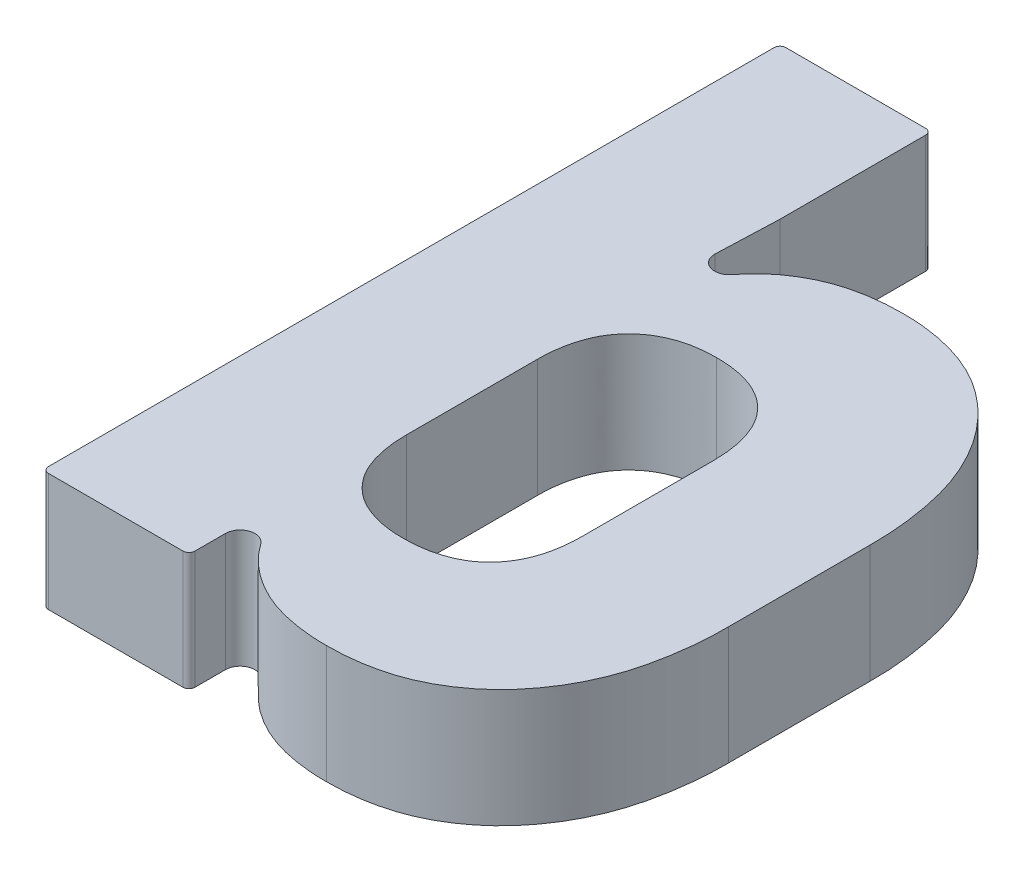
ISO-10303-21;
HEADER;
FILE_DESCRIPTION(('STEP AP214'),'2;1');
FILE_NAME('part.step','',(''),(''),'','','');
FILE_SCHEMA(('AUTOMOTIVE_DESIGN { 1 0 10303 214 1 1 1 1 }'));
ENDSEC;
DATA;
#1=APPLICATION_CONTEXT('core data for automotive mechanical design processes');
#2=APPLICATION_PROTOCOL_DEFINITION('international standard','automotive_design',2000,#1);
#3=PRODUCT_CONTEXT('',#1,'mechanical');
#4=PRODUCT('Part','Part','',(#3));
#5=PRODUCT_RELATED_PRODUCT_CATEGORY('part','',(#4));
#6=PRODUCT_DEFINITION_FORMATION('','',#4);
#7=PRODUCT_DEFINITION_CONTEXT('part definition',#1,'design');
#8=PRODUCT_DEFINITION('design','',#6,#7);
#9=PRODUCT_DEFINITION_SHAPE('','',#8);
#10=(LENGTH_UNIT() NAMED_UNIT(*) SI_UNIT(.MILLI.,.METRE.));
#11=(NAMED_UNIT(*) PLANE_ANGLE_UNIT() SI_UNIT($,.RADIAN.));
#12=(NAMED_UNIT(*) SI_UNIT($,.STERADIAN.) SOLID_ANGLE_UNIT());
#13=UNCERTAINTY_MEASURE_WITH_UNIT(LENGTH_MEASURE(1.E-05),#10,'distance_accuracy_value','');
#14=(GEOMETRIC_REPRESENTATION_CONTEXT(3) GLOBAL_UNCERTAINTY_ASSIGNED_CONTEXT((#13)) GLOBAL_UNIT_ASSIGNED_CONTEXT((#10,
#11,#12)) REPRESENTATION_CONTEXT('',''));
#15=CARTESIAN_POINT('',(0.,0.,0.));
#16=DIRECTION('',(0.,0.,1.));
#17=DIRECTION('',(1.,0.,0.));
#18=AXIS2_PLACEMENT_3D('',#15,#16,#17);
#19=CARTESIAN_POINT('',(61.1375346809354,-20.,1.70927467300832));
#20=CARTESIAN_POINT('',(63.3979546676921,-20.,1.73186455888931));
#21=CARTESIAN_POINT('',(66.7284266563258,-20.,1.41604169961417));
#22=CARTESIAN_POINT('',(70.9849618294125,-20.,0.392480025110739));
#23=CARTESIAN_POINT('',(73.9363258875433,-20.,-0.707761560131336));
#24=CARTESIAN_POINT('',(76.6987396412212,-20.,-2.13104256253094));
#25=CARTESIAN_POINT('',(79.2902262722292,-20.,-3.85133171437285));
#26=CARTESIAN_POINT('',(81.7126400639447,-20.,-5.87312312196566));
#27=CARTESIAN_POINT('',(83.9353444595553,-20.,-8.20256890534453));
#28=CARTESIAN_POINT('',(85.9321639266618,-20.,-10.7957695291212));
#29=CARTESIAN_POINT('',(87.6850431376321,-20.,-13.6254976606838));
#30=CARTESIAN_POINT('',(89.1629047665182,-20.,-16.6737628612502));
#31=CARTESIAN_POINT('',(90.3920844894946,-20.,-19.936614782158));
#32=CARTESIAN_POINT('',(91.2918251452278,-20.,-23.4290958431584));
#33=CARTESIAN_POINT('',(92.2002185265201,-20.,-28.4812107490383));
#34=CARTESIAN_POINT('',(92.4817069455452,-20.,-32.4172065655511));
#35=CARTESIAN_POINT('',(92.4494649227111,-20.,-35.1020610384463));
#36=B_SPLINE_CURVE_WITH_KNOTS('',3,(#19,#20,#21,#22,#23,#24,#25,#26,#27,#28,#29,#30,#31,#32,#33,
#34,#35),.UNSPECIFIED.,.F.,.F.,(4,1,1,1,1,1,1,1,1,1,1,1,1,1,4),(0.,0.124383118868739,
0.183396982942082,0.24067306301679,0.297423080854385,0.354185854166794,0.411660215520877,
0.470847323329664,0.531159531667356,0.591613899126881,0.653855247276131,0.717465676104442,
0.783323982148507,0.852192973667389,1.),.UNSPECIFIED.);
#37=DIRECTION('',(0.,1.,0.));
#38=VECTOR('',#37,1.);
#39=SURFACE_OF_LINEAR_EXTRUSION('',#36,#38);
#40=CARTESIAN_POINT('',(61.1375346809354,0.,1.70927467300832));
#41=CARTESIAN_POINT('',(63.3979546676921,0.,1.73186455888931));
#42=CARTESIAN_POINT('',(66.7284266563258,0.,1.41604169961417));
#43=CARTESIAN_POINT('',(70.9849618294125,0.,0.392480025110739));
#44=CARTESIAN_POINT('',(73.9363258875433,0.,-0.707761560131336));
#45=CARTESIAN_POINT('',(76.6987396412212,0.,-2.13104256253094));
#46=CARTESIAN_POINT('',(79.2902262722292,0.,-3.85133171437285));
#47=CARTESIAN_POINT('',(81.7126400639447,0.,-5.87312312196566));
#48=CARTESIAN_POINT('',(83.9353444595553,0.,-8.20256890534453));
#49=CARTESIAN_POINT('',(85.9321639266618,0.,-10.7957695291212));
#50=CARTESIAN_POINT('',(87.6850431376321,0.,-13.6254976606838));
#51=CARTESIAN_POINT('',(89.1629047665182,0.,-16.6737628612502));
#52=CARTESIAN_POINT('',(90.3920844894946,0.,-19.936614782158));
#53=CARTESIAN_POINT('',(91.2918251452278,0.,-23.4290958431584));
#54=CARTESIAN_POINT('',(92.2002185265201,0.,-28.4812107490383));
#55=CARTESIAN_POINT('',(92.4817069455452,0.,-32.4172065655511));
#56=CARTESIAN_POINT('',(92.4494649227111,0.,-35.1020610384463));
#57=B_SPLINE_CURVE_WITH_KNOTS('',3,(#40,#41,#42,#43,#44,#45,#46,#47,#48,#49,#50,#51,#52,#53,#54,
#55,#56),.UNSPECIFIED.,.F.,.F.,(4,1,1,1,1,1,1,1,1,1,1,1,1,1,4),(0.,0.124383118868739,
0.183396982942082,0.24067306301679,0.297423080854385,0.354185854166794,0.411660215520877,
0.470847323329664,0.531159531667356,0.591613899126881,0.653855247276131,0.717465676104442,
0.783323982148507,0.852192973667389,1.),.UNSPECIFIED.);
#58=CARTESIAN_POINT('',(61.1375346809354,0.,1.70927467300832));
#59=VERTEX_POINT('',#58);
#60=CARTESIAN_POINT('',(92.4494649227111,0.,-35.1020610384463));
#61=VERTEX_POINT('',#60);
#62=EDGE_CURVE('E270',#59,#61,#57,.T.);
#63=ORIENTED_EDGE('',*,*,#62,.F.);
#64=DIRECTION('',(0.,1.,0.));
#65=VECTOR('',#64,1.);
#66=CARTESIAN_POINT('',(61.1375346809354,-20.,1.70927467300832));
#67=LINE('',#66,#65);
#68=CARTESIAN_POINT('',(61.1375346809354,-20.,1.70927467300832));
#69=VERTEX_POINT('',#68);
#70=EDGE_CURVE('E333',#69,#59,#67,.T.);
#71=ORIENTED_EDGE('',*,*,#70,.F.);
#72=CARTESIAN_POINT('',(92.4494649227111,-20.,-35.1020610384463));
#73=VERTEX_POINT('',#72);
#74=EDGE_CURVE('E332',#69,#73,#36,.T.);
#75=ORIENTED_EDGE('',*,*,#74,.T.);
#76=DIRECTION('',(0.,1.,0.));
#77=VECTOR('',#76,1.);
#78=CARTESIAN_POINT('',(92.4494649227111,-20.,-35.1020610384463));
#79=LINE('',#78,#77);
#80=EDGE_CURVE('E267',#73,#61,#79,.T.);
#81=ORIENTED_EDGE('',*,*,#80,.T.);
#82=EDGE_LOOP('',(#63,#71,#75,#81));
#83=FACE_BOUND('',#82,.T.);
#84=ADVANCED_FACE('F39',(#83),#39,.T.);
#85=CARTESIAN_POINT('',(36.1177170035672,-20.,-19.9167657550535));
#86=CARTESIAN_POINT('',(36.5093462277742,-20.,-17.6313012704122));
#87=CARTESIAN_POINT('',(37.2412546198471,-20.,-14.5655906823967));
#88=CARTESIAN_POINT('',(38.6541482286939,-20.,-10.8719535861835));
#89=CARTESIAN_POINT('',(39.8415150829055,-20.,-8.75873732793582));
#90=CARTESIAN_POINT('',(41.2151968207104,-20.,-6.81140589130793));
#91=CARTESIAN_POINT('',(42.7706585997565,-20.,-5.01967593620793));
#92=CARTESIAN_POINT('',(44.5312001852481,-20.,-3.43826920193407));
#93=CARTESIAN_POINT('',(46.4557129878383,-20.,-2.06741748795849));
#94=CARTESIAN_POINT('',(48.5240280453065,-20.,-0.899662475210069));
#95=CARTESIAN_POINT('',(50.7430171108584,-20.,0.0788037016159963));
#96=CARTESIAN_POINT('',(53.1296900281825,-20.,0.816810272829216));
#97=CARTESIAN_POINT('',(56.595091542222,-20.,1.51448102218447));
#98=CARTESIAN_POINT('',(59.2963502461155,-20.,1.72633675084407));
#99=CARTESIAN_POINT('',(61.1375346809354,-20.,1.70927467300832));
#100=B_SPLINE_CURVE_WITH_KNOTS('',3,(#85,#86,#87,#88,#89,#90,#91,#92,#93,#94,#95,#96,#97,#98,
#99),.UNSPECIFIED.,.F.,.F.,(4,1,1,1,1,1,1,1,1,1,1,1,4),(0.,0.189683364362305,0.257345762284267,
0.323006356272036,0.387526038875919,0.45220136129118,0.516820130784999,0.580788520198441,
0.645269234150389,0.710957662219097,0.778950204744827,0.849350041064619,1.),.UNSPECIFIED.);
#101=DIRECTION('',(0.,1.,0.));
#102=VECTOR('',#101,1.);
#103=SURFACE_OF_LINEAR_EXTRUSION('',#100,#102);
#104=CARTESIAN_POINT('',(36.1177170035672,0.,-19.9167657550535));
#105=CARTESIAN_POINT('',(36.5093462277742,0.,-17.6313012704122));
#106=CARTESIAN_POINT('',(37.2412546198471,0.,-14.5655906823967));
#107=CARTESIAN_POINT('',(38.6541482286939,0.,-10.8719535861835));
#108=CARTESIAN_POINT('',(39.8415150829055,0.,-8.75873732793582));
#109=CARTESIAN_POINT('',(41.2151968207104,0.,-6.81140589130793));
#110=CARTESIAN_POINT('',(42.7706585997565,0.,-5.01967593620793));
#111=CARTESIAN_POINT('',(44.5312001852481,0.,-3.43826920193407));
#112=CARTESIAN_POINT('',(46.4557129878383,0.,-2.06741748795849));
#113=CARTESIAN_POINT('',(48.5240280453065,0.,-0.899662475210069));
#114=CARTESIAN_POINT('',(50.7430171108584,0.,0.0788037016159963));
#115=CARTESIAN_POINT('',(53.1296900281825,0.,0.816810272829216));
#116=CARTESIAN_POINT('',(56.595091542222,0.,1.51448102218447));
#117=CARTESIAN_POINT('',(59.2963502461155,0.,1.72633675084407));
#118=CARTESIAN_POINT('',(61.1375346809354,0.,1.70927467300832));
#119=B_SPLINE_CURVE_WITH_KNOTS('',3,(#104,#105,#106,#107,#108,#109,#110,#111,#112,#113,#114,
#115,#116,#117,#118),.UNSPECIFIED.,.F.,.F.,(4,1,1,1,1,1,1,1,1,1,1,1,4),(0.,0.189683364362305,
0.257345762284267,0.323006356272036,0.387526038875919,0.45220136129118,0.516820130784999,
0.580788520198441,0.645269234150389,0.710957662219097,0.778950204744827,0.849350041064619,1.),.UNSPECIFIED.);
#120=CARTESIAN_POINT('',(40.6491337185177,0.,-7.63240091221413));
#121=VERTEX_POINT('',#120);
#122=EDGE_CURVE('E327',#121,#59,#119,.T.);
#123=ORIENTED_EDGE('',*,*,#122,.F.);
#124=DIRECTION('',(0.,1.,0.));
#125=VECTOR('',#124,1.);
#126=CARTESIAN_POINT('',(40.6491337185177,0.,-7.63240091221414));
#127=LINE('',#126,#125);
#128=CARTESIAN_POINT('',(40.6491337185177,-20.,-7.63240091221413));
#129=VERTEX_POINT('',#128);
#130=EDGE_CURVE('E363',#121,#129,#127,.F.);
#131=ORIENTED_EDGE('',*,*,#130,.T.);
#132=EDGE_CURVE('E260',#129,#69,#100,.T.);
#133=ORIENTED_EDGE('',*,*,#132,.T.);
#134=ORIENTED_EDGE('',*,*,#70,.T.);
#135=EDGE_LOOP('',(#123,#131,#133,#134));
#136=FACE_BOUND('',#135,.T.);
#137=ADVANCED_FACE('F253',(#136),#103,.T.);
#138=CARTESIAN_POINT('',(36.1177170035672,-20.,-19.9167657550535));
#139=DIRECTION('',(1.,0.,0.));
#140=DIRECTION('',(0.,0.,-1.));
#141=AXIS2_PLACEMENT_3D('',#138,#139,#140);
#142=PLANE('',#141);
#143=DIRECTION('',(0.,0.,-1.));
#144=VECTOR('',#143,1.);
#145=CARTESIAN_POINT('',(36.1177170035672,0.,-19.9167657550535));
#146=LINE('',#145,#144);
#147=CARTESIAN_POINT('',(36.1177170035672,0.,-1.));
#148=VERTEX_POINT('',#147);
#149=CARTESIAN_POINT('',(36.1177170035672,0.,-6.17523032157633));
#150=VERTEX_POINT('',#149);
#151=EDGE_CURVE('E324',#148,#150,#146,.T.);
#152=ORIENTED_EDGE('',*,*,#151,.F.);
#153=DIRECTION('',(0.,1.,0.));
#154=VECTOR('',#153,1.);
#155=CARTESIAN_POINT('',(36.1177170035672,-20.,-1.));
#156=LINE('',#155,#154);
#157=CARTESIAN_POINT('',(36.1177170035672,-20.,-1.));
#158=VERTEX_POINT('',#157);
#159=EDGE_CURVE('E11',#148,#158,#156,.F.);
#160=ORIENTED_EDGE('',*,*,#159,.T.);
#161=DIRECTION('',(0.,0.,-1.));
#162=VECTOR('',#161,1.);
#163=CARTESIAN_POINT('',(36.1177170035672,-20.,-19.9167657550535));
#164=LINE('',#163,#162);
#165=CARTESIAN_POINT('',(36.1177170035672,-20.,-6.17523032157633));
#166=VERTEX_POINT('',#165);
#167=EDGE_CURVE('E268',#158,#166,#164,.T.);
#168=ORIENTED_EDGE('',*,*,#167,.T.);
#169=DIRECTION('',(0.,-1.,0.));
#170=VECTOR('',#169,1.);
#171=CARTESIAN_POINT('',(36.1177170035672,0.,-6.17523032157633));
#172=LINE('',#171,#170);
#173=EDGE_CURVE('E359',#166,#150,#172,.F.);
#174=ORIENTED_EDGE('',*,*,#173,.T.);
#175=EDGE_LOOP('',(#152,#160,#168,#174));
#176=FACE_BOUND('',#175,.T.);
#177=ADVANCED_FACE('F257',(#176),#142,.T.);
#178=CARTESIAN_POINT('',(36.1177170035672,-20.,0.));
#179=DIRECTION('',(0.,0.,1.));
#180=DIRECTION('',(1.,0.,0.));
#181=AXIS2_PLACEMENT_3D('',#178,#179,#180);
#182=PLANE('',#181);
#183=DIRECTION('',(1.,0.,0.));
#184=VECTOR('',#183,1.);
#185=CARTESIAN_POINT('',(36.1177170035672,0.,0.));
#186=LINE('',#185,#184);
#187=CARTESIAN_POINT('',(12.2960760998811,0.,0.));
#188=VERTEX_POINT('',#187);
#189=CARTESIAN_POINT('',(35.1177170035672,0.,0.));
#190=VERTEX_POINT('',#189);
#191=EDGE_CURVE('E320',#188,#190,#186,.T.);
#192=ORIENTED_EDGE('',*,*,#191,.F.);
#193=DIRECTION('',(0.,1.,0.));
#194=VECTOR('',#193,1.);
#195=CARTESIAN_POINT('',(12.2960760998811,-20.,0.));
#196=LINE('',#195,#194);
#197=CARTESIAN_POINT('',(12.2960760998811,-20.,0.));
#198=VERTEX_POINT('',#197);
#199=EDGE_CURVE('E48',#188,#198,#196,.F.);
#200=ORIENTED_EDGE('',*,*,#199,.T.);
#201=DIRECTION('',(1.,0.,0.));
#202=VECTOR('',#201,1.);
#203=CARTESIAN_POINT('',(36.1177170035672,-20.,0.));
#204=LINE('',#203,#202);
#205=CARTESIAN_POINT('',(35.1177170035672,-20.,0.));
#206=VERTEX_POINT('',#205);
#207=EDGE_CURVE('E428',#198,#206,#204,.T.);
#208=ORIENTED_EDGE('',*,*,#207,.T.);
#209=DIRECTION('',(0.,1.,0.));
#210=VECTOR('',#209,1.);
#211=CARTESIAN_POINT('',(35.1177170035672,-20.,0.));
#212=LINE('',#211,#210);
#213=EDGE_CURVE('E419',#206,#190,#212,.T.);
#214=ORIENTED_EDGE('',*,*,#213,.T.);
#215=EDGE_LOOP('',(#192,#200,#208,#214));
#216=FACE_BOUND('',#215,.T.);
#217=ADVANCED_FACE('F427',(#216),#182,.T.);
#218=CARTESIAN_POINT('',(11.2960760998811,-20.,0.));
#219=DIRECTION('',(-1.,0.,0.));
#220=DIRECTION('',(0.,0.,1.));
#221=AXIS2_PLACEMENT_3D('',#218,#219,#220);
#222=PLANE('',#221);
#223=DIRECTION('',(0.,0.,1.));
#224=VECTOR('',#223,1.);
#225=CARTESIAN_POINT('',(11.2960760998811,0.,0.));
#226=LINE('',#225,#224);
#227=CARTESIAN_POINT('',(11.2960760998811,0.,-124.));
#228=VERTEX_POINT('',#227);
#229=CARTESIAN_POINT('',(11.2960760998811,0.,-1.));
#230=VERTEX_POINT('',#229);
#231=EDGE_CURVE('E316',#228,#230,#226,.T.);
#232=ORIENTED_EDGE('',*,*,#231,.F.);
#233=DIRECTION('',(0.,1.,0.));
#234=VECTOR('',#233,1.);
#235=CARTESIAN_POINT('',(11.2960760998811,-20.,-124.));
#236=LINE('',#235,#234);
#237=CARTESIAN_POINT('',(11.2960760998811,-20.,-124.));
#238=VERTEX_POINT('',#237);
#239=EDGE_CURVE('E62',#228,#238,#236,.F.);
#240=ORIENTED_EDGE('',*,*,#239,.T.);
#241=DIRECTION('',(0.,0.,1.));
#242=VECTOR('',#241,1.);
#243=CARTESIAN_POINT('',(11.2960760998811,-20.,0.));
#244=LINE('',#243,#242);
#245=CARTESIAN_POINT('',(11.2960760998811,-20.,-1.));
#246=VERTEX_POINT('',#245);
#247=EDGE_CURVE('E435',#238,#246,#244,.T.);
#248=ORIENTED_EDGE('',*,*,#247,.T.);
#249=DIRECTION('',(0.,1.,0.));
#250=VECTOR('',#249,1.);
#251=CARTESIAN_POINT('',(11.2960760998811,-20.,-1.));
#252=LINE('',#251,#250);
#253=EDGE_CURVE('E413',#246,#230,#252,.T.);
#254=ORIENTED_EDGE('',*,*,#253,.T.);
#255=EDGE_LOOP('',(#232,#240,#248,#254));
#256=FACE_BOUND('',#255,.T.);
#257=ADVANCED_FACE('F438',(#256),#222,.T.);
#258=CARTESIAN_POINT('',(11.2960760998811,-20.,-125.));
#259=DIRECTION('',(0.,0.,-1.));
#260=DIRECTION('',(-1.,0.,0.));
#261=AXIS2_PLACEMENT_3D('',#258,#259,#260);
#262=PLANE('',#261);
#263=DIRECTION('',(-1.,0.,0.));
#264=VECTOR('',#263,1.);
#265=CARTESIAN_POINT('',(11.2960760998811,0.,-125.));
#266=LINE('',#265,#264);
#267=CARTESIAN_POINT('',(35.9847403884265,0.,-125.));
#268=VERTEX_POINT('',#267);
#269=CARTESIAN_POINT('',(12.2960760998811,0.,-125.));
#270=VERTEX_POINT('',#269);
#271=EDGE_CURVE('E312',#268,#270,#266,.T.);
#272=ORIENTED_EDGE('',*,*,#271,.F.);
#273=DIRECTION('',(0.,1.,0.));
#274=VECTOR('',#273,1.);
#275=CARTESIAN_POINT('',(35.9847403884265,-20.,-125.));
#276=LINE('',#275,#274);
#277=CARTESIAN_POINT('',(35.9847403884265,-20.,-125.));
#278=VERTEX_POINT('',#277);
#279=EDGE_CURVE('E399',#268,#278,#276,.F.);
#280=ORIENTED_EDGE('',*,*,#279,.T.);
#281=DIRECTION('',(-1.,0.,0.));
#282=VECTOR('',#281,1.);
#283=CARTESIAN_POINT('',(11.2960760998811,-20.,-125.));
#284=LINE('',#283,#282);
#285=CARTESIAN_POINT('',(12.2960760998811,-20.,-125.));
#286=VERTEX_POINT('',#285);
#287=EDGE_CURVE('E449',#278,#286,#284,.T.);
#288=ORIENTED_EDGE('',*,*,#287,.T.);
#289=DIRECTION('',(0.,1.,0.));
#290=VECTOR('',#289,1.);
#291=CARTESIAN_POINT('',(12.2960760998811,-20.,-125.));
#292=LINE('',#291,#290);
#293=EDGE_CURVE('E395',#286,#270,#292,.T.);
#294=ORIENTED_EDGE('',*,*,#293,.T.);
#295=EDGE_LOOP('',(#272,#280,#288,#294));
#296=FACE_BOUND('',#295,.T.);
#297=ADVANCED_FACE('F447',(#296),#262,.T.);
#298=CARTESIAN_POINT('',(36.9847403884265,-20.,-125.));
#299=DIRECTION('',(1.,0.,0.));
#300=DIRECTION('',(0.,0.,-1.));
#301=AXIS2_PLACEMENT_3D('',#298,#299,#300);
#302=PLANE('',#301);
#303=DIRECTION('',(0.,0.,-1.));
#304=VECTOR('',#303,1.);
#305=CARTESIAN_POINT('',(36.9847403884265,-20.,-125.));
#306=LINE('',#305,#304);
#307=CARTESIAN_POINT('',(36.9847403884265,-20.,-99.3113357114546));
#308=VERTEX_POINT('',#307);
#309=CARTESIAN_POINT('',(36.9847403884265,-20.,-124.));
#310=VERTEX_POINT('',#309);
#311=EDGE_CURVE('E452',#308,#310,#306,.T.);
#312=ORIENTED_EDGE('',*,*,#311,.T.);
#313=DIRECTION('',(0.,1.,0.));
#314=VECTOR('',#313,1.);
#315=CARTESIAN_POINT('',(36.9847403884265,-20.,-124.));
#316=LINE('',#315,#314);
#317=CARTESIAN_POINT('',(36.9847403884265,0.,-124.));
#318=VERTEX_POINT('',#317);
#319=EDGE_CURVE('E379',#310,#318,#316,.T.);
#320=ORIENTED_EDGE('',*,*,#319,.T.);
#321=DIRECTION('',(0.,0.,-1.));
#322=VECTOR('',#321,1.);
#323=CARTESIAN_POINT('',(36.9847403884265,0.,-125.));
#324=LINE('',#323,#322);
#325=CARTESIAN_POINT('',(36.9847403884265,0.,-99.3113357114546));
#326=VERTEX_POINT('',#325);
#327=EDGE_CURVE('E308',#326,#318,#324,.T.);
#328=ORIENTED_EDGE('',*,*,#327,.F.);
#329=DIRECTION('',(0.,1.,0.));
#330=VECTOR('',#329,1.);
#331=CARTESIAN_POINT('',(36.9847403884265,-20.,-99.3113357114546));
#332=LINE('',#331,#330);
#333=EDGE_CURVE('E341',#308,#326,#332,.T.);
#334=ORIENTED_EDGE('',*,*,#333,.F.);
#335=EDGE_LOOP('',(#312,#320,#328,#334));
#336=FACE_BOUND('',#335,.T.);
#337=ADVANCED_FACE('F530',(#336),#302,.T.);
#338=CARTESIAN_POINT('',(36.9847403884265,-20.,-99.3113357114546));
#339=DIRECTION('',(0.999297114266338,0.,0.0374870300099914));
#340=DIRECTION('',(0.0374870300099914,0.,-0.999297114266338));
#341=AXIS2_PLACEMENT_3D('',#338,#339,#340);
#342=PLANE('',#341);
#343=DIRECTION('',(0.0374870300099914,0.,-0.999297114266338));
#344=VECTOR('',#343,1.);
#345=CARTESIAN_POINT('',(36.9847403884265,0.,-99.3113357114546));
#346=LINE('',#345,#344);
#347=CARTESIAN_POINT('',(36.5879739283109,0.,-88.7346755032317));
#348=VERTEX_POINT('',#347);
#349=EDGE_CURVE('E302',#348,#326,#346,.T.);
#350=ORIENTED_EDGE('',*,*,#349,.F.);
#351=DIRECTION('',(0.,-1.,0.));
#352=VECTOR('',#351,1.);
#353=CARTESIAN_POINT('',(36.5879739283109,-20.,-88.7346755032317));
#354=LINE('',#353,#352);
#355=CARTESIAN_POINT('',(36.5879739283109,-20.,-88.7346755032317));
#356=VERTEX_POINT('',#355);
#357=EDGE_CURVE('E356',#348,#356,#354,.T.);
#358=ORIENTED_EDGE('',*,*,#357,.T.);
#359=DIRECTION('',(0.0374870300099914,0.,-0.999297114266338));
#360=VECTOR('',#359,1.);
#361=CARTESIAN_POINT('',(36.9847403884265,-20.,-99.3113357114546));
#362=LINE('',#361,#360);
#363=EDGE_CURVE('E458',#356,#308,#362,.T.);
#364=ORIENTED_EDGE('',*,*,#363,.T.);
#365=ORIENTED_EDGE('',*,*,#333,.T.);
#366=EDGE_LOOP('',(#350,#358,#364,#365));
#367=FACE_BOUND('',#366,.T.);
#368=ADVANCED_FACE('F484',(#367),#342,.T.);
#369=CARTESIAN_POINT('',(61.1375346809354,-20.,-95.892786365438));
#370=CARTESIAN_POINT('',(59.2963502559396,-20.,-95.9098484311514));
#371=CARTESIAN_POINT('',(56.5950915238848,-20.,-95.6979927372411));
#372=CARTESIAN_POINT('',(53.1296900534273,-20.,-95.0003219341083));
#373=CARTESIAN_POINT('',(50.7430170209451,-20.,-94.2623155049933));
#374=CARTESIAN_POINT('',(48.524028366243,-20.,-93.2838488212033));
#375=CARTESIAN_POINT('',(46.4557118170452,-20.,-92.1160956491593));
#376=CARTESIAN_POINT('',(44.5312045377388,-20.,-90.7452371197839));
#377=CARTESIAN_POINT('',(42.7706421607478,-20.,-89.1638560409692));
#378=CARTESIAN_POINT('',(41.2152581499435,-20.,-87.3720301245385));
#379=CARTESIAN_POINT('',(39.8412851183988,-20.,-85.4250581268569));
#380=CARTESIAN_POINT('',(37.8217167849367,-20.,-81.8250028336131));
#381=CARTESIAN_POINT('',(37.0790355262526,-20.,-78.5138406991105));
#382=CARTESIAN_POINT('',(36.1177170035672,-20.,-76.1989694807769));
#383=B_SPLINE_CURVE_WITH_KNOTS('',3,(#369,#370,#371,#372,#373,#374,#375,#376,#377,#378,#379,
#380,#381,#382),.UNSPECIFIED.,.F.,.F.,(4,1,1,1,1,1,1,1,1,1,1,4),(0.,0.158696290840259,
0.232856237372369,0.304480314669729,0.373677212958315,0.441601892176416,0.508986883202487,
0.577056991616717,0.645186673488069,0.713152402704225,0.78231998027188,1.),.UNSPECIFIED.);
#384=DIRECTION('',(0.,1.,0.));
#385=VECTOR('',#384,1.);
#386=SURFACE_OF_LINEAR_EXTRUSION('',#383,#385);
#387=CARTESIAN_POINT('',(61.1375346809354,-20.,-95.892786365438));
#388=VERTEX_POINT('',#387);
#389=CARTESIAN_POINT('',(41.0723909289633,-20.,-87.1226984023934));
#390=VERTEX_POINT('',#389);
#391=EDGE_CURVE('E463',#388,#390,#383,.T.);
#392=ORIENTED_EDGE('',*,*,#391,.T.);
#393=DIRECTION('',(0.,1.,0.));
#394=VECTOR('',#393,1.);
#395=CARTESIAN_POINT('',(41.0723909289633,-20.,-87.1226984023934));
#396=LINE('',#395,#394);
#397=CARTESIAN_POINT('',(41.0723909289633,0.,-87.1226984023934));
#398=VERTEX_POINT('',#397);
#399=EDGE_CURVE('E340',#390,#398,#396,.T.);
#400=ORIENTED_EDGE('',*,*,#399,.T.);
#401=CARTESIAN_POINT('',(61.1375346809354,0.,-95.892786365438));
#402=CARTESIAN_POINT('',(59.2963502559396,0.,-95.9098484311514));
#403=CARTESIAN_POINT('',(56.5950915238848,0.,-95.6979927372411));
#404=CARTESIAN_POINT('',(53.1296900534273,0.,-95.0003219341083));
#405=CARTESIAN_POINT('',(50.7430170209451,0.,-94.2623155049933));
#406=CARTESIAN_POINT('',(48.524028366243,0.,-93.2838488212033));
#407=CARTESIAN_POINT('',(46.4557118170452,0.,-92.1160956491593));
#408=CARTESIAN_POINT('',(44.5312045377388,0.,-90.7452371197839));
#409=CARTESIAN_POINT('',(42.7706421607478,0.,-89.1638560409692));
#410=CARTESIAN_POINT('',(41.2152581499435,0.,-87.3720301245385));
#411=CARTESIAN_POINT('',(39.8412851183988,0.,-85.4250581268569));
#412=CARTESIAN_POINT('',(37.8217167849367,0.,-81.8250028336131));
#413=CARTESIAN_POINT('',(37.0790355262526,0.,-78.5138406991105));
#414=CARTESIAN_POINT('',(36.1177170035672,0.,-76.1989694807769));
#415=B_SPLINE_CURVE_WITH_KNOTS('',3,(#401,#402,#403,#404,#405,#406,#407,#408,#409,#410,#411,
#412,#413,#414),.UNSPECIFIED.,.F.,.F.,(4,1,1,1,1,1,1,1,1,1,1,4),(0.,0.158696290840259,
0.232856237372369,0.304480314669729,0.373677212958315,0.441601892176416,0.508986883202487,
0.577056991616717,0.645186673488069,0.713152402704225,0.78231998027188,1.),.UNSPECIFIED.);
#416=CARTESIAN_POINT('',(61.1375346809354,0.,-95.892786365438));
#417=VERTEX_POINT('',#416);
#418=EDGE_CURVE('E293',#417,#398,#415,.T.);
#419=ORIENTED_EDGE('',*,*,#418,.F.);
#420=DIRECTION('',(0.,1.,0.));
#421=VECTOR('',#420,1.);
#422=CARTESIAN_POINT('',(61.1375346809354,-20.,-95.892786365438));
#423=LINE('',#422,#421);
#424=EDGE_CURVE('E345',#388,#417,#423,.T.);
#425=ORIENTED_EDGE('',*,*,#424,.F.);
#426=EDGE_LOOP('',(#392,#400,#419,#425));
#427=FACE_BOUND('',#426,.T.);
#428=ADVANCED_FACE('F479',(#427),#386,.T.);
#429=CARTESIAN_POINT('',(92.4494649227111,-20.,-59.0814506539834));
#430=CARTESIAN_POINT('',(92.4800557869528,-20.,-61.7415061275085));
#431=CARTESIAN_POINT('',(92.1999394512338,-20.,-65.6447988554345));
#432=CARTESIAN_POINT('',(91.2890560833157,-20.,-70.6632025053452));
#433=CARTESIAN_POINT('',(90.3909211515332,-20.,-74.1471014501256));
#434=CARTESIAN_POINT('',(89.1706207419676,-20.,-77.4064056562238));
#435=CARTESIAN_POINT('',(87.6701707646687,-20.,-80.4422772334976));
#436=CARTESIAN_POINT('',(85.9421827260527,-20.,-83.2867943912857));
#437=CARTESIAN_POINT('',(83.9266577445487,-20.,-85.8823990208844));
#438=CARTESIAN_POINT('',(81.7145715201555,-20.,-88.2364176211913));
#439=CARTESIAN_POINT('',(79.2899144097604,-20.,-90.2802816828061));
#440=CARTESIAN_POINT('',(76.7059467698162,-20.,-92.0300633156162));
#441=CARTESIAN_POINT('',(73.9359779138035,-20.,-93.4517444928701));
#442=CARTESIAN_POINT('',(70.9812897292457,-20.,-94.5441674234126));
#443=CARTESIAN_POINT('',(66.7358211058271,-20.,-95.6213346368769));
#444=CARTESIAN_POINT('',(63.3950860572187,-20.,-95.9036858412536));
#445=CARTESIAN_POINT('',(61.1375346809354,-20.,-95.892786365438));
#446=B_SPLINE_CURVE_WITH_KNOTS('',3,(#429,#430,#431,#432,#433,#434,#435,#436,#437,#438,#439,
#440,#441,#442,#443,#444,#445),.UNSPECIFIED.,.F.,.F.,(4,1,1,1,1,1,1,1,1,1,1,1,1,1,4),(0.,
0.146569579880017,0.215048987167087,0.280963005864434,0.344627245760464,0.406512461734148,
0.467405398034917,0.527768627319755,0.587335420624009,0.645151215103698,0.702214916846585,
0.759012942206047,0.816337474823528,0.875511659573163,1.),.UNSPECIFIED.);
#447=DIRECTION('',(0.,1.,0.));
#448=VECTOR('',#447,1.);
#449=SURFACE_OF_LINEAR_EXTRUSION('',#446,#448);
#450=CARTESIAN_POINT('',(92.4494649227111,0.,-59.0814506539834));
#451=CARTESIAN_POINT('',(92.4800557869528,0.,-61.7415061275085));
#452=CARTESIAN_POINT('',(92.1999394512338,0.,-65.6447988554345));
#453=CARTESIAN_POINT('',(91.2890560833157,0.,-70.6632025053452));
#454=CARTESIAN_POINT('',(90.3909211515332,0.,-74.1471014501256));
#455=CARTESIAN_POINT('',(89.1706207419676,0.,-77.4064056562238));
#456=CARTESIAN_POINT('',(87.6701707646687,0.,-80.4422772334976));
#457=CARTESIAN_POINT('',(85.9421827260527,0.,-83.2867943912857));
#458=CARTESIAN_POINT('',(83.9266577445487,0.,-85.8823990208844));
#459=CARTESIAN_POINT('',(81.7145715201555,0.,-88.2364176211913));
#460=CARTESIAN_POINT('',(79.2899144097604,0.,-90.2802816828061));
#461=CARTESIAN_POINT('',(76.7059467698162,0.,-92.0300633156162));
#462=CARTESIAN_POINT('',(73.9359779138035,0.,-93.4517444928701));
#463=CARTESIAN_POINT('',(70.9812897292457,0.,-94.5441674234126));
#464=CARTESIAN_POINT('',(66.7358211058271,0.,-95.6213346368769));
#465=CARTESIAN_POINT('',(63.3950860572187,0.,-95.9036858412536));
#466=CARTESIAN_POINT('',(61.1375346809354,0.,-95.892786365438));
#467=B_SPLINE_CURVE_WITH_KNOTS('',3,(#450,#451,#452,#453,#454,#455,#456,#457,#458,#459,#460,
#461,#462,#463,#464,#465,#466),.UNSPECIFIED.,.F.,.F.,(4,1,1,1,1,1,1,1,1,1,1,1,1,1,4),(0.,
0.146569579880017,0.215048987167087,0.280963005864434,0.344627245760464,0.406512461734148,
0.467405398034917,0.527768627319755,0.587335420624009,0.645151215103698,0.702214916846585,
0.759012942206047,0.816337474823528,0.875511659573163,1.),.UNSPECIFIED.);
#468=CARTESIAN_POINT('',(92.4494649227111,0.,-59.0814506539834));
#469=VERTEX_POINT('',#468);
#470=EDGE_CURVE('E287',#469,#417,#467,.T.);
#471=ORIENTED_EDGE('',*,*,#470,.F.);
#472=DIRECTION('',(0.,1.,0.));
#473=VECTOR('',#472,1.);
#474=CARTESIAN_POINT('',(92.4494649227111,-20.,-59.0814506539834));
#475=LINE('',#474,#473);
#476=CARTESIAN_POINT('',(92.4494649227111,-20.,-59.0814506539834));
#477=VERTEX_POINT('',#476);
#478=EDGE_CURVE('E348',#477,#469,#475,.T.);
#479=ORIENTED_EDGE('',*,*,#478,.F.);
#480=EDGE_CURVE('E470',#477,#388,#446,.T.);
#481=ORIENTED_EDGE('',*,*,#480,.T.);
#482=ORIENTED_EDGE('',*,*,#424,.T.);
#483=EDGE_LOOP('',(#471,#479,#481,#482));
#484=FACE_BOUND('',#483,.T.);
#485=ADVANCED_FACE('F483',(#484),#449,.T.);
#486=CARTESIAN_POINT('',(92.4494649227111,-20.,-59.0814506539834));
#487=DIRECTION('',(1.,0.,0.));
#488=DIRECTION('',(0.,0.,-1.));
#489=AXIS2_PLACEMENT_3D('',#486,#487,#488);
#490=PLANE('',#489);
#491=DIRECTION('',(0.,0.,-1.));
#492=VECTOR('',#491,1.);
#493=CARTESIAN_POINT('',(92.4494649227111,0.,-59.0814506539834));
#494=LINE('',#493,#492);
#495=EDGE_CURVE('E279',#61,#469,#494,.T.);
#496=ORIENTED_EDGE('',*,*,#495,.F.);
#497=ORIENTED_EDGE('',*,*,#80,.F.);
#498=DIRECTION('',(0.,0.,-1.));
#499=VECTOR('',#498,1.);
#500=CARTESIAN_POINT('',(92.4494649227111,-20.,-59.0814506539834));
#501=LINE('',#500,#499);
#502=EDGE_CURVE('E504',#73,#477,#501,.T.);
#503=ORIENTED_EDGE('',*,*,#502,.T.);
#504=ORIENTED_EDGE('',*,*,#478,.T.);
#505=EDGE_LOOP('',(#496,#497,#503,#504));
#506=FACE_BOUND('',#505,.T.);
#507=ADVANCED_FACE('F249',(#506),#490,.T.);
#508=CARTESIAN_POINT('',(84.8820141266287,-20.,-9.4554747688445));
#509=DIRECTION('',(0.,1.,0.));
#510=DIRECTION('',(0.,0.,1.));
#511=AXIS2_PLACEMENT_3D('',#508,#509,#510);
#512=PLANE('',#511);
#513=DIRECTION('',(0.,0.,1.));
#514=VECTOR('',#513,1.);
#515=CARTESIAN_POINT('',(36.9847403884265,-20.,-58.2144272691241));
#516=LINE('',#515,#514);
#517=CARTESIAN_POINT('',(36.9847403884265,-20.,-58.2144272691241));
#518=VERTEX_POINT('',#517);
#519=CARTESIAN_POINT('',(36.9847403884265,-20.,-35.9690844233056));
#520=VERTEX_POINT('',#519);
#521=EDGE_CURVE('E209',#518,#520,#516,.T.);
#522=ORIENTED_EDGE('',*,*,#521,.T.);
#523=CARTESIAN_POINT('',(36.9847403884265,-20.,-35.9690844233056));
#524=CARTESIAN_POINT('',(36.9676489984493,-20.,-33.758379721644));
#525=CARTESIAN_POINT('',(37.3874013916378,-20.,-30.5481449650094));
#526=CARTESIAN_POINT('',(39.0708930694956,-20.,-26.743120106332));
#527=CARTESIAN_POINT('',(40.8411022053026,-20.,-24.4886800208604));
#528=CARTESIAN_POINT('',(43.0311596970135,-20.,-22.6809147300343));
#529=CARTESIAN_POINT('',(46.6717992887209,-20.,-20.9673763809136));
#530=CARTESIAN_POINT('',(49.7546511148949,-20.,-20.5037073960029));
#531=CARTESIAN_POINT('',(51.8727705112961,-20.,-20.5360681728102));
#532=B_SPLINE_CURVE_WITH_KNOTS('',3,(#523,#524,#525,#526,#527,#528,#529,#530,#531),
.UNSPECIFIED.,.F.,.F.,(4,1,1,1,1,1,4),(0.,0.272641396745838,0.392383520100458,0.508393070737775,
0.622649227525496,0.739144110686285,1.),.UNSPECIFIED.);
#533=CARTESIAN_POINT('',(51.8727705112961,-20.,-20.5360681728102));
#534=VERTEX_POINT('',#533);
#535=EDGE_CURVE('E200',#520,#534,#532,.T.);
#536=ORIENTED_EDGE('',*,*,#535,.T.);
#537=CARTESIAN_POINT('',(51.8727705112961,-20.,-20.5360681728102));
#538=CARTESIAN_POINT('',(54.0283272674292,-20.,-20.5098314357424));
#539=CARTESIAN_POINT('',(57.1608747824831,-20.,-20.9479792886064));
#540=CARTESIAN_POINT('',(60.8329548119721,-20.,-22.6763743116499));
#541=CARTESIAN_POINT('',(63.0084588722773,-20.,-24.4821463649469));
#542=CARTESIAN_POINT('',(64.7163994413659,-20.,-26.7603018989594));
#543=CARTESIAN_POINT('',(66.4248937484094,-20.,-30.5381078539507));
#544=CARTESIAN_POINT('',(66.7715764562094,-20.,-33.7700739099952));
#545=CARTESIAN_POINT('',(66.7855727308759,-20.,-35.9690844233056));
#546=B_SPLINE_CURVE_WITH_KNOTS('',3,(#537,#538,#539,#540,#541,#542,#543,#544,#545),
.UNSPECIFIED.,.F.,.F.,(4,1,1,1,1,1,4),(0.,0.26513970781187,0.381314934979138,0.494473274442137,
0.608929805408105,0.728343362508408,1.),.UNSPECIFIED.);
#547=CARTESIAN_POINT('',(66.7855727308759,-20.,-35.9690844233056));
#548=VERTEX_POINT('',#547);
#549=EDGE_CURVE('E213',#534,#548,#546,.T.);
#550=ORIENTED_EDGE('',*,*,#549,.T.);
#551=DIRECTION('',(0.,0.,-1.));
#552=VECTOR('',#551,1.);
#553=CARTESIAN_POINT('',(66.7855727308759,-20.,-35.9690844233056));
#554=LINE('',#553,#552);
#555=CARTESIAN_POINT('',(66.7855727308759,-20.,-58.2144272691241));
#556=VERTEX_POINT('',#555);
#557=EDGE_CURVE('E218',#548,#556,#554,.T.);
#558=ORIENTED_EDGE('',*,*,#557,.T.);
#559=CARTESIAN_POINT('',(66.7855727308759,-20.,-58.2144272691241));
#560=CARTESIAN_POINT('',(66.7718298021772,-20.,-60.4067707491371));
#561=CARTESIAN_POINT('',(66.4178363417972,-20.,-63.6257246329802));
#562=CARTESIAN_POINT('',(64.7238174675498,-20.,-67.3955889096678));
#563=CARTESIAN_POINT('',(63.0003548679581,-20.,-69.655005362182));
#564=CARTESIAN_POINT('',(60.827701935591,-20.,-71.4536429840326));
#565=CARTESIAN_POINT('',(57.1736592814545,-20.,-73.2298096738757));
#566=CARTESIAN_POINT('',(54.0230857334708,-20.,-73.637658684725));
#567=CARTESIAN_POINT('',(51.8727705112961,-20.,-73.6226714229092));
#568=B_SPLINE_CURVE_WITH_KNOTS('',3,(#559,#560,#561,#562,#563,#564,#565,#566,#567),
.UNSPECIFIED.,.F.,.F.,(4,1,1,1,1,1,4),(0.,0.271016724171996,0.390594505472297,0.504399399100119,
0.6177133602381,0.734495657238293,1.),.UNSPECIFIED.);
#569=CARTESIAN_POINT('',(51.8727705112961,-20.,-73.6226714229092));
#570=VERTEX_POINT('',#569);
#571=EDGE_CURVE('E734',#556,#570,#568,.T.);
#572=ORIENTED_EDGE('',*,*,#571,.T.);
#573=CARTESIAN_POINT('',(51.8727705112961,-20.,-73.6226714229092));
#574=CARTESIAN_POINT('',(49.7597205249256,-20.,-73.6441595429033));
#575=CARTESIAN_POINT('',(46.65920107881,-20.,-73.209984567179));
#576=CARTESIAN_POINT('',(43.0364445143774,-20.,-71.4490549796394));
#577=CARTESIAN_POINT('',(40.8491838360312,-20.,-69.64831243722));
#578=CARTESIAN_POINT('',(39.0635405866509,-20.,-67.4129145239681));
#579=CARTESIAN_POINT('',(37.3944092462139,-20.,-63.6156432901511));
#580=CARTESIAN_POINT('',(36.9676908716522,-20.,-60.4184094795924));
#581=CARTESIAN_POINT('',(36.9847403884265,-20.,-58.2144272691241));
#582=B_SPLINE_CURVE_WITH_KNOTS('',3,(#573,#574,#575,#576,#577,#578,#579,#580,#581),
.UNSPECIFIED.,.F.,.F.,(4,1,1,1,1,1,4),(0.,0.26121334390883,0.378316389386696,0.492729113037336,
0.60809508546493,0.728001293181742,1.),.UNSPECIFIED.);
#583=EDGE_CURVE('E740',#570,#518,#582,.T.);
#584=ORIENTED_EDGE('',*,*,#583,.T.);
#585=EDGE_LOOP('',(#522,#536,#550,#558,#572,#584));
#586=FACE_BOUND('',#585,.T.);
#587=ORIENTED_EDGE('',*,*,#287,.F.);
#588=CARTESIAN_POINT('',(35.9847403884265,-20.,-124.));
#589=DIRECTION('',(0.,1.,0.));
#590=DIRECTION('',(0.,0.,1.));
#591=AXIS2_PLACEMENT_3D('',#588,#589,#590);
#592=CIRCLE('',#591,1.);
#593=EDGE_CURVE('E410',#278,#310,#592,.F.);
#594=ORIENTED_EDGE('',*,*,#593,.T.);
#595=ORIENTED_EDGE('',*,*,#311,.F.);
#596=ORIENTED_EDGE('',*,*,#363,.F.);
#597=CARTESIAN_POINT('',(39.0862167139769,-20.,-88.6409579282068));
#598=DIRECTION('',(0.,1.,0.));
#599=DIRECTION('',(0.,0.,1.));
#600=AXIS2_PLACEMENT_3D('',#597,#598,#599);
#601=CIRCLE('',#600,2.5);
#602=EDGE_CURVE('E369',#356,#390,#601,.T.);
#603=ORIENTED_EDGE('',*,*,#602,.T.);
#604=ORIENTED_EDGE('',*,*,#391,.F.);
#605=ORIENTED_EDGE('',*,*,#480,.F.);
#606=ORIENTED_EDGE('',*,*,#502,.F.);
#607=ORIENTED_EDGE('',*,*,#74,.F.);
#608=ORIENTED_EDGE('',*,*,#132,.F.);
#609=CARTESIAN_POINT('',(38.6177170035672,-20.,-6.17523032157633));
#610=DIRECTION('',(0.,1.,0.));
#611=DIRECTION('',(0.,0.,1.));
#612=AXIS2_PLACEMENT_3D('',#609,#610,#611);
#613=CIRCLE('',#612,2.5);
#614=EDGE_CURVE('E375',#129,#166,#613,.T.);
#615=ORIENTED_EDGE('',*,*,#614,.T.);
#616=ORIENTED_EDGE('',*,*,#167,.F.);
#617=CARTESIAN_POINT('',(35.1177170035672,-20.,-1.));
#618=DIRECTION('',(0.,1.,0.));
#619=DIRECTION('',(0.,0.,1.));
#620=AXIS2_PLACEMENT_3D('',#617,#618,#619);
#621=CIRCLE('',#620,1.);
#622=EDGE_CURVE('E402',#158,#206,#621,.F.);
#623=ORIENTED_EDGE('',*,*,#622,.T.);
#624=ORIENTED_EDGE('',*,*,#207,.F.);
#625=CARTESIAN_POINT('',(12.2960760998811,-20.,-1.));
#626=DIRECTION('',(0.,1.,0.));
#627=DIRECTION('',(0.,0.,1.));
#628=AXIS2_PLACEMENT_3D('',#625,#626,#627);
#629=CIRCLE('',#628,1.);
#630=EDGE_CURVE('E55',#198,#246,#629,.F.);
#631=ORIENTED_EDGE('',*,*,#630,.T.);
#632=ORIENTED_EDGE('',*,*,#247,.F.);
#633=CARTESIAN_POINT('',(12.2960760998811,-20.,-124.));
#634=DIRECTION('',(0.,1.,0.));
#635=DIRECTION('',(0.,0.,1.));
#636=AXIS2_PLACEMENT_3D('',#633,#634,#635);
#637=CIRCLE('',#636,1.);
#638=EDGE_CURVE('E407',#238,#286,#637,.F.);
#639=ORIENTED_EDGE('',*,*,#638,.T.);
#640=EDGE_LOOP('',(#587,#594,#595,#596,#603,#604,#605,#606,#607,#608,#615,#616,#623,#624,#631,
#632,#639));
#641=FACE_BOUND('',#640,.T.);
#642=ADVANCED_FACE('F220',(#586,#641),#512,.F.);
#643=CARTESIAN_POINT('',(84.8820141266287,0.,-9.4554747688445));
#644=DIRECTION('',(0.,1.,0.));
#645=DIRECTION('',(0.,0.,1.));
#646=AXIS2_PLACEMENT_3D('',#643,#644,#645);
#647=PLANE('',#646);
#648=CARTESIAN_POINT('',(36.9847403884265,0.,-35.9690844233056));
#649=CARTESIAN_POINT('',(36.9676489984493,0.,-33.758379721644));
#650=CARTESIAN_POINT('',(37.3874013916378,0.,-30.5481449650094));
#651=CARTESIAN_POINT('',(39.0708930694956,0.,-26.743120106332));
#652=CARTESIAN_POINT('',(40.8411022053026,0.,-24.4886800208604));
#653=CARTESIAN_POINT('',(43.0311596970135,0.,-22.6809147300343));
#654=CARTESIAN_POINT('',(46.6717992887209,0.,-20.9673763809136));
#655=CARTESIAN_POINT('',(49.7546511148949,0.,-20.5037073960029));
#656=CARTESIAN_POINT('',(51.8727705112961,0.,-20.5360681728102));
#657=B_SPLINE_CURVE_WITH_KNOTS('',3,(#648,#649,#650,#651,#652,#653,#654,#655,#656),
.UNSPECIFIED.,.F.,.F.,(4,1,1,1,1,1,4),(0.,0.272641396745838,0.392383520100458,0.508393070737775,
0.622649227525496,0.739144110686285,1.),.UNSPECIFIED.);
#658=CARTESIAN_POINT('',(36.9847403884265,0.,-35.9690844233056));
#659=VERTEX_POINT('',#658);
#660=CARTESIAN_POINT('',(51.8727705112961,0.,-20.5360681728102));
#661=VERTEX_POINT('',#660);
#662=EDGE_CURVE('E203',#659,#661,#657,.T.);
#663=ORIENTED_EDGE('',*,*,#662,.F.);
#664=DIRECTION('',(0.,0.,1.));
#665=VECTOR('',#664,1.);
#666=CARTESIAN_POINT('',(36.9847403884265,0.,-58.2144272691241));
#667=LINE('',#666,#665);
#668=CARTESIAN_POINT('',(36.9847403884265,0.,-58.2144272691241));
#669=VERTEX_POINT('',#668);
#670=EDGE_CURVE('E224',#669,#659,#667,.T.);
#671=ORIENTED_EDGE('',*,*,#670,.F.);
#672=CARTESIAN_POINT('',(51.8727705112961,0.,-73.6226714229092));
#673=CARTESIAN_POINT('',(49.7597205249256,0.,-73.6441595429033));
#674=CARTESIAN_POINT('',(46.65920107881,0.,-73.209984567179));
#675=CARTESIAN_POINT('',(43.0364445143774,0.,-71.4490549796394));
#676=CARTESIAN_POINT('',(40.8491838360312,0.,-69.64831243722));
#677=CARTESIAN_POINT('',(39.0635405866509,0.,-67.4129145239681));
#678=CARTESIAN_POINT('',(37.3944092462139,0.,-63.6156432901511));
#679=CARTESIAN_POINT('',(36.9676908716522,0.,-60.4184094795924));
#680=CARTESIAN_POINT('',(36.9847403884265,0.,-58.2144272691241));
#681=B_SPLINE_CURVE_WITH_KNOTS('',3,(#672,#673,#674,#675,#676,#677,#678,#679,#680),
.UNSPECIFIED.,.F.,.F.,(4,1,1,1,1,1,4),(0.,0.26121334390883,0.378316389386696,0.492729113037336,
0.60809508546493,0.728001293181742,1.),.UNSPECIFIED.);
#682=CARTESIAN_POINT('',(51.8727705112961,0.,-73.6226714229092));
#683=VERTEX_POINT('',#682);
#684=EDGE_CURVE('E228',#683,#669,#681,.T.);
#685=ORIENTED_EDGE('',*,*,#684,.F.);
#686=CARTESIAN_POINT('',(66.7855727308759,0.,-58.2144272691241));
#687=CARTESIAN_POINT('',(66.7718298021772,0.,-60.4067707491371));
#688=CARTESIAN_POINT('',(66.4178363417972,0.,-63.6257246329802));
#689=CARTESIAN_POINT('',(64.7238174675498,0.,-67.3955889096678));
#690=CARTESIAN_POINT('',(63.0003548679581,0.,-69.655005362182));
#691=CARTESIAN_POINT('',(60.827701935591,0.,-71.4536429840326));
#692=CARTESIAN_POINT('',(57.1736592814545,0.,-73.2298096738757));
#693=CARTESIAN_POINT('',(54.0230857334708,0.,-73.637658684725));
#694=CARTESIAN_POINT('',(51.8727705112961,0.,-73.6226714229092));
#695=B_SPLINE_CURVE_WITH_KNOTS('',3,(#686,#687,#688,#689,#690,#691,#692,#693,#694),
.UNSPECIFIED.,.F.,.F.,(4,1,1,1,1,1,4),(0.,0.271016724171996,0.390594505472297,0.504399399100119,
0.6177133602381,0.734495657238293,1.),.UNSPECIFIED.);
#696=CARTESIAN_POINT('',(66.7855727308759,0.,-58.2144272691241));
#697=VERTEX_POINT('',#696);
#698=EDGE_CURVE('E772',#697,#683,#695,.T.);
#699=ORIENTED_EDGE('',*,*,#698,.F.);
#700=DIRECTION('',(0.,0.,-1.));
#701=VECTOR('',#700,1.);
#702=CARTESIAN_POINT('',(66.7855727308759,0.,-35.9690844233056));
#703=LINE('',#702,#701);
#704=CARTESIAN_POINT('',(66.7855727308759,0.,-35.9690844233056));
#705=VERTEX_POINT('',#704);
#706=EDGE_CURVE('E766',#705,#697,#703,.T.);
#707=ORIENTED_EDGE('',*,*,#706,.F.);
#708=CARTESIAN_POINT('',(51.8727705112961,0.,-20.5360681728102));
#709=CARTESIAN_POINT('',(54.0283272674292,0.,-20.5098314357424));
#710=CARTESIAN_POINT('',(57.1608747824831,0.,-20.9479792886064));
#711=CARTESIAN_POINT('',(60.8329548119721,0.,-22.6763743116499));
#712=CARTESIAN_POINT('',(63.0084588722773,0.,-24.4821463649469));
#713=CARTESIAN_POINT('',(64.7163994413659,0.,-26.7603018989594));
#714=CARTESIAN_POINT('',(66.4248937484094,0.,-30.5381078539507));
#715=CARTESIAN_POINT('',(66.7715764562094,0.,-33.7700739099952));
#716=CARTESIAN_POINT('',(66.7855727308759,0.,-35.9690844233056));
#717=B_SPLINE_CURVE_WITH_KNOTS('',3,(#708,#709,#710,#711,#712,#713,#714,#715,#716),
.UNSPECIFIED.,.F.,.F.,(4,1,1,1,1,1,4),(0.,0.26513970781187,0.381314934979138,0.494473274442137,
0.608929805408105,0.728343362508408,1.),.UNSPECIFIED.);
#718=EDGE_CURVE('E758',#661,#705,#717,.T.);
#719=ORIENTED_EDGE('',*,*,#718,.F.);
#720=EDGE_LOOP('',(#663,#671,#685,#699,#707,#719));
#721=FACE_BOUND('',#720,.T.);
#722=ORIENTED_EDGE('',*,*,#327,.T.);
#723=CARTESIAN_POINT('',(35.9847403884265,0.,-124.));
#724=DIRECTION('',(0.,1.,0.));
#725=DIRECTION('',(0.,0.,1.));
#726=AXIS2_PLACEMENT_3D('',#723,#724,#725);
#727=CIRCLE('',#726,1.);
#728=EDGE_CURVE('E392',#318,#268,#727,.T.);
#729=ORIENTED_EDGE('',*,*,#728,.T.);
#730=ORIENTED_EDGE('',*,*,#271,.T.);
#731=CARTESIAN_POINT('',(12.2960760998811,0.,-124.));
#732=DIRECTION('',(0.,1.,0.));
#733=DIRECTION('',(0.,0.,1.));
#734=AXIS2_PLACEMENT_3D('',#731,#732,#733);
#735=CIRCLE('',#734,1.);
#736=EDGE_CURVE('E389',#270,#228,#735,.T.);
#737=ORIENTED_EDGE('',*,*,#736,.T.);
#738=ORIENTED_EDGE('',*,*,#231,.T.);
#739=CARTESIAN_POINT('',(12.2960760998811,0.,-1.));
#740=DIRECTION('',(0.,1.,0.));
#741=DIRECTION('',(0.,0.,1.));
#742=AXIS2_PLACEMENT_3D('',#739,#740,#741);
#743=CIRCLE('',#742,1.);
#744=EDGE_CURVE('E386',#230,#188,#743,.T.);
#745=ORIENTED_EDGE('',*,*,#744,.T.);
#746=ORIENTED_EDGE('',*,*,#191,.T.);
#747=CARTESIAN_POINT('',(35.1177170035672,0.,-1.));
#748=DIRECTION('',(0.,1.,0.));
#749=DIRECTION('',(0.,0.,1.));
#750=AXIS2_PLACEMENT_3D('',#747,#748,#749);
#751=CIRCLE('',#750,1.);
#752=EDGE_CURVE('E383',#190,#148,#751,.T.);
#753=ORIENTED_EDGE('',*,*,#752,.T.);
#754=ORIENTED_EDGE('',*,*,#151,.T.);
#755=CARTESIAN_POINT('',(38.6177170035672,0.,-6.17523032157633));
#756=DIRECTION('',(0.,1.,0.));
#757=DIRECTION('',(0.,0.,1.));
#758=AXIS2_PLACEMENT_3D('',#755,#756,#757);
#759=CIRCLE('',#758,2.5);
#760=EDGE_CURVE('E372',#150,#121,#759,.F.);
#761=ORIENTED_EDGE('',*,*,#760,.T.);
#762=ORIENTED_EDGE('',*,*,#122,.T.);
#763=ORIENTED_EDGE('',*,*,#62,.T.);
#764=ORIENTED_EDGE('',*,*,#495,.T.);
#765=ORIENTED_EDGE('',*,*,#470,.T.);
#766=ORIENTED_EDGE('',*,*,#418,.T.);
#767=CARTESIAN_POINT('',(39.0862167139769,0.,-88.6409579282068));
#768=DIRECTION('',(0.,1.,0.));
#769=DIRECTION('',(0.,0.,1.));
#770=AXIS2_PLACEMENT_3D('',#767,#768,#769);
#771=CIRCLE('',#770,2.5);
#772=EDGE_CURVE('E366',#398,#348,#771,.F.);
#773=ORIENTED_EDGE('',*,*,#772,.T.);
#774=ORIENTED_EDGE('',*,*,#349,.T.);
#775=EDGE_LOOP('',(#722,#729,#730,#737,#738,#745,#746,#753,#754,#761,#762,#763,#764,#765,#766,
#773,#774));
#776=FACE_BOUND('',#775,.T.);
#777=ADVANCED_FACE('F245',(#721,#776),#647,.T.);
#778=DIRECTION('',(0.,1.,0.));
#779=VECTOR('',#778,1.);
#780=SURFACE_OF_LINEAR_EXTRUSION('',#532,#779);
#781=ORIENTED_EDGE('',*,*,#662,.T.);
#782=DIRECTION('',(0.,1.,0.));
#783=VECTOR('',#782,1.);
#784=CARTESIAN_POINT('',(51.8727705112961,-20.,-20.5360681728102));
#785=LINE('',#784,#783);
#786=EDGE_CURVE('E196',#534,#661,#785,.T.);
#787=ORIENTED_EDGE('',*,*,#786,.F.);
#788=ORIENTED_EDGE('',*,*,#535,.F.);
#789=DIRECTION('',(0.,1.,0.));
#790=VECTOR('',#789,1.);
#791=CARTESIAN_POINT('',(36.9847403884265,-20.,-35.9690844233056));
#792=LINE('',#791,#790);
#793=EDGE_CURVE('E280',#520,#659,#792,.T.);
#794=ORIENTED_EDGE('',*,*,#793,.T.);
#795=EDGE_LOOP('',(#781,#787,#788,#794));
#796=FACE_BOUND('',#795,.T.);
#797=ADVANCED_FACE('F198',(#796),#780,.F.);
#798=CARTESIAN_POINT('',(36.9847403884265,-20.,-58.2144272691241));
#799=DIRECTION('',(-1.,0.,0.));
#800=DIRECTION('',(0.,0.,1.));
#801=AXIS2_PLACEMENT_3D('',#798,#799,#800);
#802=PLANE('',#801);
#803=ORIENTED_EDGE('',*,*,#670,.T.);
#804=ORIENTED_EDGE('',*,*,#793,.F.);
#805=ORIENTED_EDGE('',*,*,#521,.F.);
#806=DIRECTION('',(0.,1.,0.));
#807=VECTOR('',#806,1.);
#808=CARTESIAN_POINT('',(36.9847403884265,-20.,-58.2144272691241));
#809=LINE('',#808,#807);
#810=EDGE_CURVE('E791',#518,#669,#809,.T.);
#811=ORIENTED_EDGE('',*,*,#810,.T.);
#812=EDGE_LOOP('',(#803,#804,#805,#811));
#813=FACE_BOUND('',#812,.T.);
#814=ADVANCED_FACE('F244',(#813),#802,.F.);
#815=DIRECTION('',(0.,1.,0.));
#816=VECTOR('',#815,1.);
#817=SURFACE_OF_LINEAR_EXTRUSION('',#582,#816);
#818=ORIENTED_EDGE('',*,*,#684,.T.);
#819=ORIENTED_EDGE('',*,*,#810,.F.);
#820=ORIENTED_EDGE('',*,*,#583,.F.);
#821=DIRECTION('',(0.,1.,0.));
#822=VECTOR('',#821,1.);
#823=CARTESIAN_POINT('',(51.8727705112961,-20.,-73.6226714229092));
#824=LINE('',#823,#822);
#825=EDGE_CURVE('E794',#570,#683,#824,.T.);
#826=ORIENTED_EDGE('',*,*,#825,.T.);
#827=EDGE_LOOP('',(#818,#819,#820,#826));
#828=FACE_BOUND('',#827,.T.);
#829=ADVANCED_FACE('F612',(#828),#817,.F.);
#830=DIRECTION('',(0.,1.,0.));
#831=VECTOR('',#830,1.);
#832=SURFACE_OF_LINEAR_EXTRUSION('',#568,#831);
#833=ORIENTED_EDGE('',*,*,#698,.T.);
#834=ORIENTED_EDGE('',*,*,#825,.F.);
#835=ORIENTED_EDGE('',*,*,#571,.F.);
#836=DIRECTION('',(0.,1.,0.));
#837=VECTOR('',#836,1.);
#838=CARTESIAN_POINT('',(66.7855727308759,-20.,-58.2144272691241));
#839=LINE('',#838,#837);
#840=EDGE_CURVE('E797',#556,#697,#839,.T.);
#841=ORIENTED_EDGE('',*,*,#840,.T.);
#842=EDGE_LOOP('',(#833,#834,#835,#841));
#843=FACE_BOUND('',#842,.T.);
#844=ADVANCED_FACE('F620',(#843),#832,.F.);
#845=CARTESIAN_POINT('',(66.7855727308759,-20.,-35.9690844233056));
#846=DIRECTION('',(1.,0.,0.));
#847=DIRECTION('',(0.,0.,-1.));
#848=AXIS2_PLACEMENT_3D('',#845,#846,#847);
#849=PLANE('',#848);
#850=ORIENTED_EDGE('',*,*,#706,.T.);
#851=ORIENTED_EDGE('',*,*,#840,.F.);
#852=ORIENTED_EDGE('',*,*,#557,.F.);
#853=DIRECTION('',(0.,1.,0.));
#854=VECTOR('',#853,1.);
#855=CARTESIAN_POINT('',(66.7855727308759,-20.,-35.9690844233056));
#856=LINE('',#855,#854);
#857=EDGE_CURVE('E208',#548,#705,#856,.T.);
#858=ORIENTED_EDGE('',*,*,#857,.T.);
#859=EDGE_LOOP('',(#850,#851,#852,#858));
#860=FACE_BOUND('',#859,.T.);
#861=ADVANCED_FACE('F628',(#860),#849,.F.);
#862=DIRECTION('',(0.,1.,0.));
#863=VECTOR('',#862,1.);
#864=SURFACE_OF_LINEAR_EXTRUSION('',#546,#863);
#865=ORIENTED_EDGE('',*,*,#718,.T.);
#866=ORIENTED_EDGE('',*,*,#857,.F.);
#867=ORIENTED_EDGE('',*,*,#549,.F.);
#868=ORIENTED_EDGE('',*,*,#786,.T.);
#869=EDGE_LOOP('',(#865,#866,#867,#868));
#870=FACE_BOUND('',#869,.T.);
#871=ADVANCED_FACE('F214',(#870),#864,.F.);
#872=CARTESIAN_POINT('',(39.0862167139769,-9.99999999999999,-88.6409579282068));
#873=DIRECTION('',(0.,1.,0.));
#874=DIRECTION('',(0.,0.,1.));
#875=AXIS2_PLACEMENT_3D('',#872,#873,#874);
#876=CYLINDRICAL_SURFACE('',#875,2.5);
#877=ORIENTED_EDGE('',*,*,#602,.F.);
#878=ORIENTED_EDGE('',*,*,#357,.F.);
#879=ORIENTED_EDGE('',*,*,#772,.F.);
#880=ORIENTED_EDGE('',*,*,#399,.F.);
#881=EDGE_LOOP('',(#877,#878,#879,#880));
#882=FACE_BOUND('',#881,.T.);
#883=ADVANCED_FACE('F497',(#882),#876,.F.);
#884=CARTESIAN_POINT('',(38.6177170035672,-10.,-6.17523032157633));
#885=DIRECTION('',(0.,1.,0.));
#886=DIRECTION('',(0.,0.,1.));
#887=AXIS2_PLACEMENT_3D('',#884,#885,#886);
#888=CYLINDRICAL_SURFACE('',#887,2.5);
#889=ORIENTED_EDGE('',*,*,#614,.F.);
#890=ORIENTED_EDGE('',*,*,#130,.F.);
#891=ORIENTED_EDGE('',*,*,#760,.F.);
#892=ORIENTED_EDGE('',*,*,#173,.F.);
#893=EDGE_LOOP('',(#889,#890,#891,#892));
#894=FACE_BOUND('',#893,.T.);
#895=ADVANCED_FACE('F535',(#894),#888,.F.);
#896=CARTESIAN_POINT('',(35.9847403884265,-20.,-124.));
#897=DIRECTION('',(0.,1.,0.));
#898=DIRECTION('',(0.,0.,1.));
#899=AXIS2_PLACEMENT_3D('',#896,#897,#898);
#900=CYLINDRICAL_SURFACE('',#899,1.);
#901=ORIENTED_EDGE('',*,*,#593,.F.);
#902=ORIENTED_EDGE('',*,*,#279,.F.);
#903=ORIENTED_EDGE('',*,*,#728,.F.);
#904=ORIENTED_EDGE('',*,*,#319,.F.);
#905=EDGE_LOOP('',(#901,#902,#903,#904));
#906=FACE_BOUND('',#905,.T.);
#907=ADVANCED_FACE('F533',(#906),#900,.T.);
#908=CARTESIAN_POINT('',(12.2960760998811,-20.,-124.));
#909=DIRECTION('',(0.,1.,0.));
#910=DIRECTION('',(0.,0.,1.));
#911=AXIS2_PLACEMENT_3D('',#908,#909,#910);
#912=CYLINDRICAL_SURFACE('',#911,1.);
#913=ORIENTED_EDGE('',*,*,#638,.F.);
#914=ORIENTED_EDGE('',*,*,#239,.F.);
#915=ORIENTED_EDGE('',*,*,#736,.F.);
#916=ORIENTED_EDGE('',*,*,#293,.F.);
#917=EDGE_LOOP('',(#913,#914,#915,#916));
#918=FACE_BOUND('',#917,.T.);
#919=ADVANCED_FACE('F444',(#918),#912,.T.);
#920=CARTESIAN_POINT('',(12.2960760998811,-20.,-1.));
#921=DIRECTION('',(0.,1.,0.));
#922=DIRECTION('',(0.,0.,1.));
#923=AXIS2_PLACEMENT_3D('',#920,#921,#922);
#924=CYLINDRICAL_SURFACE('',#923,1.);
#925=ORIENTED_EDGE('',*,*,#630,.F.);
#926=ORIENTED_EDGE('',*,*,#199,.F.);
#927=ORIENTED_EDGE('',*,*,#744,.F.);
#928=ORIENTED_EDGE('',*,*,#253,.F.);
#929=EDGE_LOOP('',(#925,#926,#927,#928));
#930=FACE_BOUND('',#929,.T.);
#931=ADVANCED_FACE('F437',(#930),#924,.T.);
#932=CARTESIAN_POINT('',(35.1177170035672,-20.,-1.));
#933=DIRECTION('',(0.,1.,0.));
#934=DIRECTION('',(0.,0.,1.));
#935=AXIS2_PLACEMENT_3D('',#932,#933,#934);
#936=CYLINDRICAL_SURFACE('',#935,1.);
#937=ORIENTED_EDGE('',*,*,#622,.F.);
#938=ORIENTED_EDGE('',*,*,#159,.F.);
#939=ORIENTED_EDGE('',*,*,#752,.F.);
#940=ORIENTED_EDGE('',*,*,#213,.F.);
#941=EDGE_LOOP('',(#937,#938,#939,#940));
#942=FACE_BOUND('',#941,.T.);
#943=ADVANCED_FACE('F41',(#942),#936,.T.);
#944=CLOSED_SHELL('',(#84,#137,#177,#217,#257,#297,#337,#368,#428,#485,#507,#642,#777,#797,#814,
#829,#844,#861,#871,#883,#895,#907,#919,#931,#943));
#945=MANIFOLD_SOLID_BREP('B2',#944);
#946=ADVANCED_BREP_SHAPE_REPRESENTATION('',(#18,#945),#14);
#947=SHAPE_DEFINITION_REPRESENTATION(#9,#946);
ENDSEC;
END-ISO-10303-21;
